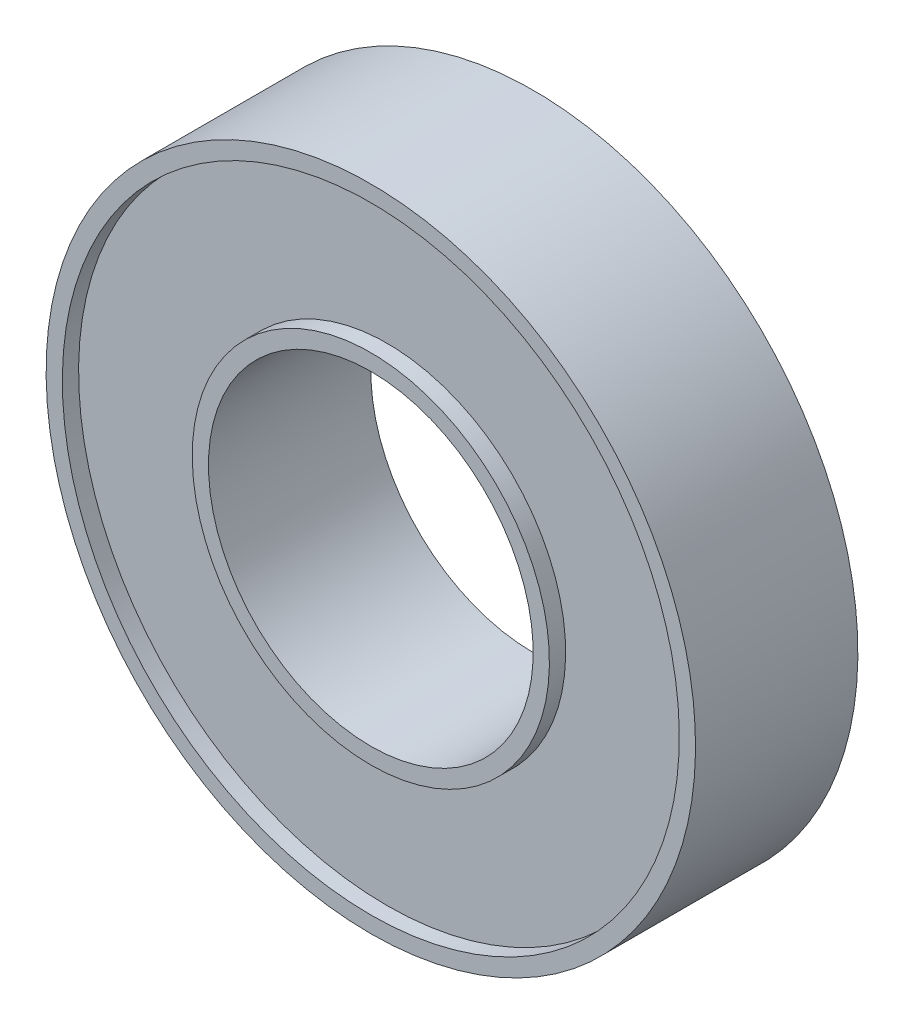
ISO-10303-21;
HEADER;
FILE_DESCRIPTION(('STEP AP214'),'2;1');
FILE_NAME('part.step','',(''),(''),'','','');
FILE_SCHEMA(('AUTOMOTIVE_DESIGN { 1 0 10303 214 1 1 1 1 }'));
ENDSEC;
DATA;
#1=APPLICATION_CONTEXT('core data for automotive mechanical design processes');
#2=APPLICATION_PROTOCOL_DEFINITION('international standard','automotive_design',2000,#1);
#3=PRODUCT_CONTEXT('',#1,'mechanical');
#4=PRODUCT('Part','Part','',(#3));
#5=PRODUCT_RELATED_PRODUCT_CATEGORY('part','',(#4));
#6=PRODUCT_DEFINITION_FORMATION('','',#4);
#7=PRODUCT_DEFINITION_CONTEXT('part definition',#1,'design');
#8=PRODUCT_DEFINITION('design','',#6,#7);
#9=PRODUCT_DEFINITION_SHAPE('','',#8);
#10=(LENGTH_UNIT() NAMED_UNIT(*) SI_UNIT(.MILLI.,.METRE.));
#11=(NAMED_UNIT(*) PLANE_ANGLE_UNIT() SI_UNIT($,.RADIAN.));
#12=(NAMED_UNIT(*) SI_UNIT($,.STERADIAN.) SOLID_ANGLE_UNIT());
#13=UNCERTAINTY_MEASURE_WITH_UNIT(LENGTH_MEASURE(1.E-05),#10,'distance_accuracy_value','');
#14=(GEOMETRIC_REPRESENTATION_CONTEXT(3) GLOBAL_UNCERTAINTY_ASSIGNED_CONTEXT((#13)) GLOBAL_UNIT_ASSIGNED_CONTEXT((#10,
#11,#12)) REPRESENTATION_CONTEXT('',''));
#15=CARTESIAN_POINT('',(0.,0.,0.));
#16=DIRECTION('',(0.,0.,1.));
#17=DIRECTION('',(1.,0.,0.));
#18=AXIS2_PLACEMENT_3D('',#15,#16,#17);
#19=CARTESIAN_POINT('',(0.,20.,5.));
#20=DIRECTION('',(0.,0.,-1.));
#21=DIRECTION('',(0.,1.,0.));
#22=AXIS2_PLACEMENT_3D('',#19,#20,#21);
#23=PLANE('',#22);
#24=CARTESIAN_POINT('',(0.,0.,5.));
#25=DIRECTION('',(0.,0.,1.));
#26=DIRECTION('',(0.,-1.,0.));
#27=AXIS2_PLACEMENT_3D('',#24,#25,#26);
#28=CIRCLE('',#27,19.);
#29=CARTESIAN_POINT('',(0.,-19.,5.));
#30=VERTEX_POINT('',#29);
#31=EDGE_CURVE('E10',#30,#30,#28,.T.);
#32=ORIENTED_EDGE('',*,*,#31,.F.);
#33=EDGE_LOOP('',(#32));
#34=FACE_BOUND('',#33,.T.);
#35=CARTESIAN_POINT('',(0.,0.,5.));
#36=DIRECTION('',(0.,0.,1.));
#37=DIRECTION('',(0.,-1.,0.));
#38=AXIS2_PLACEMENT_3D('',#35,#36,#37);
#39=CIRCLE('',#38,20.);
#40=CARTESIAN_POINT('',(0.,-20.,5.));
#41=VERTEX_POINT('',#40);
#42=EDGE_CURVE('E70',#41,#41,#39,.T.);
#43=ORIENTED_EDGE('',*,*,#42,.T.);
#44=EDGE_LOOP('',(#43));
#45=FACE_BOUND('',#44,.T.);
#46=ADVANCED_FACE('F30',(#34,#45),#23,.F.);
#47=CARTESIAN_POINT('',(0.,0.,5.));
#48=DIRECTION('',(0.,0.,1.));
#49=DIRECTION('',(0.,-1.,0.));
#50=AXIS2_PLACEMENT_3D('',#47,#48,#49);
#51=CYLINDRICAL_SURFACE('',#50,19.);
#52=CARTESIAN_POINT('',(0.,0.,4.));
#53=DIRECTION('',(0.,0.,1.));
#54=DIRECTION('',(0.,-1.,0.));
#55=AXIS2_PLACEMENT_3D('',#52,#53,#54);
#56=CIRCLE('',#55,19.);
#57=CARTESIAN_POINT('',(0.,-19.,4.));
#58=VERTEX_POINT('',#57);
#59=EDGE_CURVE('E36',#58,#58,#56,.T.);
#60=ORIENTED_EDGE('',*,*,#59,.F.);
#61=EDGE_LOOP('',(#60));
#62=FACE_BOUND('',#61,.T.);
#63=ORIENTED_EDGE('',*,*,#31,.T.);
#64=EDGE_LOOP('',(#63));
#65=FACE_BOUND('',#64,.T.);
#66=ADVANCED_FACE('F131',(#62,#65),#51,.F.);
#67=CARTESIAN_POINT('',(0.,19.,4.));
#68=DIRECTION('',(0.,0.,-1.));
#69=DIRECTION('',(0.,1.,0.));
#70=AXIS2_PLACEMENT_3D('',#67,#68,#69);
#71=PLANE('',#70);
#72=CARTESIAN_POINT('',(0.,0.,4.));
#73=DIRECTION('',(0.,0.,1.));
#74=DIRECTION('',(0.,-1.,0.));
#75=AXIS2_PLACEMENT_3D('',#72,#73,#74);
#76=CIRCLE('',#75,11.);
#77=CARTESIAN_POINT('',(0.,-11.,4.));
#78=VERTEX_POINT('',#77);
#79=EDGE_CURVE('E40',#78,#78,#76,.T.);
#80=ORIENTED_EDGE('',*,*,#79,.F.);
#81=EDGE_LOOP('',(#80));
#82=FACE_BOUND('',#81,.T.);
#83=ORIENTED_EDGE('',*,*,#59,.T.);
#84=EDGE_LOOP('',(#83));
#85=FACE_BOUND('',#84,.T.);
#86=ADVANCED_FACE('F126',(#82,#85),#71,.F.);
#87=CARTESIAN_POINT('',(0.,0.,5.));
#88=DIRECTION('',(0.,0.,1.));
#89=DIRECTION('',(0.,-1.,0.));
#90=AXIS2_PLACEMENT_3D('',#87,#88,#89);
#91=CYLINDRICAL_SURFACE('',#90,11.);
#92=CARTESIAN_POINT('',(0.,0.,5.));
#93=DIRECTION('',(0.,0.,1.));
#94=DIRECTION('',(0.,-1.,0.));
#95=AXIS2_PLACEMENT_3D('',#92,#93,#94);
#96=CIRCLE('',#95,11.);
#97=CARTESIAN_POINT('',(0.,-11.,5.));
#98=VERTEX_POINT('',#97);
#99=EDGE_CURVE('E44',#98,#98,#96,.T.);
#100=ORIENTED_EDGE('',*,*,#99,.F.);
#101=EDGE_LOOP('',(#100));
#102=FACE_BOUND('',#101,.T.);
#103=ORIENTED_EDGE('',*,*,#79,.T.);
#104=EDGE_LOOP('',(#103));
#105=FACE_BOUND('',#104,.T.);
#106=ADVANCED_FACE('F120',(#102,#105),#91,.T.);
#107=CARTESIAN_POINT('',(0.,11.,5.));
#108=DIRECTION('',(0.,0.,-1.));
#109=DIRECTION('',(0.,1.,0.));
#110=AXIS2_PLACEMENT_3D('',#107,#108,#109);
#111=PLANE('',#110);
#112=CARTESIAN_POINT('',(0.,0.,5.));
#113=DIRECTION('',(0.,0.,1.));
#114=DIRECTION('',(0.,-1.,0.));
#115=AXIS2_PLACEMENT_3D('',#112,#113,#114);
#116=CIRCLE('',#115,10.);
#117=CARTESIAN_POINT('',(0.,-10.,5.));
#118=VERTEX_POINT('',#117);
#119=EDGE_CURVE('E49',#118,#118,#116,.T.);
#120=ORIENTED_EDGE('',*,*,#119,.F.);
#121=EDGE_LOOP('',(#120));
#122=FACE_BOUND('',#121,.T.);
#123=ORIENTED_EDGE('',*,*,#99,.T.);
#124=EDGE_LOOP('',(#123));
#125=FACE_BOUND('',#124,.T.);
#126=ADVANCED_FACE('F114',(#122,#125),#111,.F.);
#127=CARTESIAN_POINT('',(0.,0.,5.));
#128=DIRECTION('',(0.,0.,1.));
#129=DIRECTION('',(0.,-1.,0.));
#130=AXIS2_PLACEMENT_3D('',#127,#128,#129);
#131=CYLINDRICAL_SURFACE('',#130,10.);
#132=CARTESIAN_POINT('',(0.,0.,-5.));
#133=DIRECTION('',(0.,0.,1.));
#134=DIRECTION('',(0.,-1.,0.));
#135=AXIS2_PLACEMENT_3D('',#132,#133,#134);
#136=CIRCLE('',#135,10.);
#137=CARTESIAN_POINT('',(0.,-10.,-5.));
#138=VERTEX_POINT('',#137);
#139=EDGE_CURVE('E52',#138,#138,#136,.T.);
#140=ORIENTED_EDGE('',*,*,#139,.F.);
#141=EDGE_LOOP('',(#140));
#142=FACE_BOUND('',#141,.T.);
#143=ORIENTED_EDGE('',*,*,#119,.T.);
#144=EDGE_LOOP('',(#143));
#145=FACE_BOUND('',#144,.T.);
#146=ADVANCED_FACE('F108',(#142,#145),#131,.F.);
#147=CARTESIAN_POINT('',(0.,11.,-5.));
#148=DIRECTION('',(0.,0.,1.));
#149=DIRECTION('',(0.,-1.,0.));
#150=AXIS2_PLACEMENT_3D('',#147,#148,#149);
#151=PLANE('',#150);
#152=CARTESIAN_POINT('',(0.,0.,-5.));
#153=DIRECTION('',(0.,0.,1.));
#154=DIRECTION('',(0.,-1.,0.));
#155=AXIS2_PLACEMENT_3D('',#152,#153,#154);
#156=CIRCLE('',#155,11.);
#157=CARTESIAN_POINT('',(0.,-11.,-5.));
#158=VERTEX_POINT('',#157);
#159=EDGE_CURVE('E55',#158,#158,#156,.T.);
#160=ORIENTED_EDGE('',*,*,#159,.F.);
#161=EDGE_LOOP('',(#160));
#162=FACE_BOUND('',#161,.T.);
#163=ORIENTED_EDGE('',*,*,#139,.T.);
#164=EDGE_LOOP('',(#163));
#165=FACE_BOUND('',#164,.T.);
#166=ADVANCED_FACE('F102',(#162,#165),#151,.F.);
#167=CARTESIAN_POINT('',(0.,0.,5.));
#168=DIRECTION('',(0.,0.,1.));
#169=DIRECTION('',(0.,-1.,0.));
#170=AXIS2_PLACEMENT_3D('',#167,#168,#169);
#171=CYLINDRICAL_SURFACE('',#170,11.);
#172=CARTESIAN_POINT('',(0.,0.,-4.));
#173=DIRECTION('',(0.,0.,1.));
#174=DIRECTION('',(0.,-1.,0.));
#175=AXIS2_PLACEMENT_3D('',#172,#173,#174);
#176=CIRCLE('',#175,11.);
#177=CARTESIAN_POINT('',(0.,-11.,-4.));
#178=VERTEX_POINT('',#177);
#179=EDGE_CURVE('E58',#178,#178,#176,.T.);
#180=ORIENTED_EDGE('',*,*,#179,.F.);
#181=EDGE_LOOP('',(#180));
#182=FACE_BOUND('',#181,.T.);
#183=ORIENTED_EDGE('',*,*,#159,.T.);
#184=EDGE_LOOP('',(#183));
#185=FACE_BOUND('',#184,.T.);
#186=ADVANCED_FACE('F96',(#182,#185),#171,.T.);
#187=CARTESIAN_POINT('',(0.,19.,-4.));
#188=DIRECTION('',(0.,0.,1.));
#189=DIRECTION('',(0.,-1.,0.));
#190=AXIS2_PLACEMENT_3D('',#187,#188,#189);
#191=PLANE('',#190);
#192=CARTESIAN_POINT('',(0.,0.,-4.));
#193=DIRECTION('',(0.,0.,1.));
#194=DIRECTION('',(0.,-1.,0.));
#195=AXIS2_PLACEMENT_3D('',#192,#193,#194);
#196=CIRCLE('',#195,19.);
#197=CARTESIAN_POINT('',(0.,-19.,-4.));
#198=VERTEX_POINT('',#197);
#199=EDGE_CURVE('E61',#198,#198,#196,.T.);
#200=ORIENTED_EDGE('',*,*,#199,.F.);
#201=EDGE_LOOP('',(#200));
#202=FACE_BOUND('',#201,.T.);
#203=ORIENTED_EDGE('',*,*,#179,.T.);
#204=EDGE_LOOP('',(#203));
#205=FACE_BOUND('',#204,.T.);
#206=ADVANCED_FACE('F90',(#202,#205),#191,.F.);
#207=CARTESIAN_POINT('',(0.,0.,5.));
#208=DIRECTION('',(0.,0.,1.));
#209=DIRECTION('',(0.,-1.,0.));
#210=AXIS2_PLACEMENT_3D('',#207,#208,#209);
#211=CYLINDRICAL_SURFACE('',#210,19.);
#212=CARTESIAN_POINT('',(0.,0.,-5.));
#213=DIRECTION('',(0.,0.,1.));
#214=DIRECTION('',(0.,-1.,0.));
#215=AXIS2_PLACEMENT_3D('',#212,#213,#214);
#216=CIRCLE('',#215,19.);
#217=CARTESIAN_POINT('',(0.,-19.,-5.));
#218=VERTEX_POINT('',#217);
#219=EDGE_CURVE('E64',#218,#218,#216,.T.);
#220=ORIENTED_EDGE('',*,*,#219,.F.);
#221=EDGE_LOOP('',(#220));
#222=FACE_BOUND('',#221,.T.);
#223=ORIENTED_EDGE('',*,*,#199,.T.);
#224=EDGE_LOOP('',(#223));
#225=FACE_BOUND('',#224,.T.);
#226=ADVANCED_FACE('F84',(#222,#225),#211,.F.);
#227=CARTESIAN_POINT('',(0.,20.,-5.));
#228=DIRECTION('',(0.,0.,1.));
#229=DIRECTION('',(0.,-1.,0.));
#230=AXIS2_PLACEMENT_3D('',#227,#228,#229);
#231=PLANE('',#230);
#232=CARTESIAN_POINT('',(0.,0.,-5.));
#233=DIRECTION('',(0.,0.,1.));
#234=DIRECTION('',(0.,-1.,0.));
#235=AXIS2_PLACEMENT_3D('',#232,#233,#234);
#236=CIRCLE('',#235,20.);
#237=CARTESIAN_POINT('',(0.,-20.,-5.));
#238=VERTEX_POINT('',#237);
#239=EDGE_CURVE('E67',#238,#238,#236,.T.);
#240=ORIENTED_EDGE('',*,*,#239,.F.);
#241=EDGE_LOOP('',(#240));
#242=FACE_BOUND('',#241,.T.);
#243=ORIENTED_EDGE('',*,*,#219,.T.);
#244=EDGE_LOOP('',(#243));
#245=FACE_BOUND('',#244,.T.);
#246=ADVANCED_FACE('F78',(#242,#245),#231,.F.);
#247=CARTESIAN_POINT('',(0.,0.,5.));
#248=DIRECTION('',(0.,0.,1.));
#249=DIRECTION('',(0.,-1.,0.));
#250=AXIS2_PLACEMENT_3D('',#247,#248,#249);
#251=CYLINDRICAL_SURFACE('',#250,20.);
#252=ORIENTED_EDGE('',*,*,#42,.F.);
#253=EDGE_LOOP('',(#252));
#254=FACE_BOUND('',#253,.T.);
#255=ORIENTED_EDGE('',*,*,#239,.T.);
#256=EDGE_LOOP('',(#255));
#257=FACE_BOUND('',#256,.T.);
#258=ADVANCED_FACE('F75',(#254,#257),#251,.T.);
#259=CLOSED_SHELL('',(#46,#66,#86,#106,#126,#146,#166,#186,#206,#226,#246,#258));
#260=MANIFOLD_SOLID_BREP('B2',#259);
#261=ADVANCED_BREP_SHAPE_REPRESENTATION('',(#18,#260),#14);
#262=SHAPE_DEFINITION_REPRESENTATION(#9,#261);
ENDSEC;
END-ISO-10303-21;
